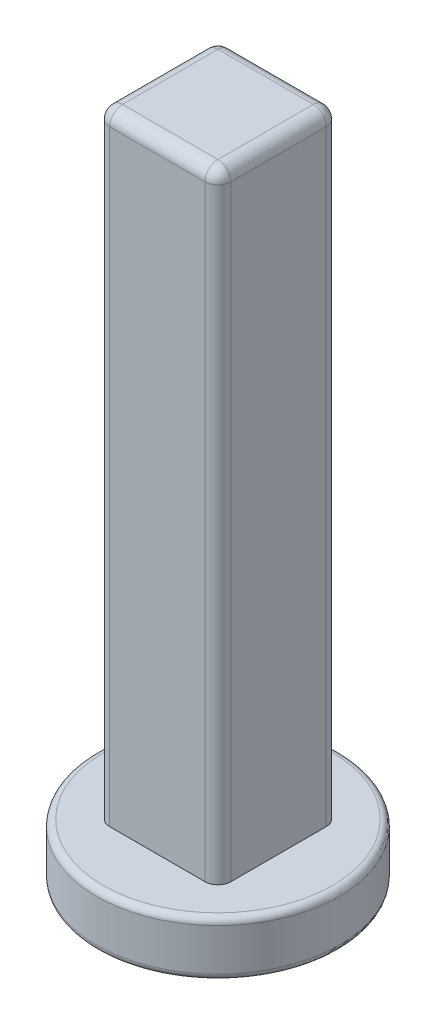
ISO-10303-21;
HEADER;
FILE_DESCRIPTION(('STEP AP214'),'2;1');
FILE_NAME('part.step','',(''),(''),'','','');
FILE_SCHEMA(('AUTOMOTIVE_DESIGN { 1 0 10303 214 1 1 1 1 }'));
ENDSEC;
DATA;
#1=APPLICATION_CONTEXT('core data for automotive mechanical design processes');
#2=APPLICATION_PROTOCOL_DEFINITION('international standard','automotive_design',2000,#1);
#3=PRODUCT_CONTEXT('',#1,'mechanical');
#4=PRODUCT('Part','Part','',(#3));
#5=PRODUCT_RELATED_PRODUCT_CATEGORY('part','',(#4));
#6=PRODUCT_DEFINITION_FORMATION('','',#4);
#7=PRODUCT_DEFINITION_CONTEXT('part definition',#1,'design');
#8=PRODUCT_DEFINITION('design','',#6,#7);
#9=PRODUCT_DEFINITION_SHAPE('','',#8);
#10=(LENGTH_UNIT() NAMED_UNIT(*) SI_UNIT(.MILLI.,.METRE.));
#11=(NAMED_UNIT(*) PLANE_ANGLE_UNIT() SI_UNIT($,.RADIAN.));
#12=(NAMED_UNIT(*) SI_UNIT($,.STERADIAN.) SOLID_ANGLE_UNIT());
#13=UNCERTAINTY_MEASURE_WITH_UNIT(LENGTH_MEASURE(1.E-05),#10,'distance_accuracy_value','');
#14=(GEOMETRIC_REPRESENTATION_CONTEXT(3) GLOBAL_UNCERTAINTY_ASSIGNED_CONTEXT((#13)) GLOBAL_UNIT_ASSIGNED_CONTEXT((#10,
#11,#12)) REPRESENTATION_CONTEXT('',''));
#15=CARTESIAN_POINT('',(0.,0.,0.));
#16=DIRECTION('',(0.,0.,1.));
#17=DIRECTION('',(1.,0.,0.));
#18=AXIS2_PLACEMENT_3D('',#15,#16,#17);
#19=CARTESIAN_POINT('',(0.,-1.7,0.));
#20=DIRECTION('',(0.,-1.,0.));
#21=DIRECTION('',(0.,0.,-1.));
#22=AXIS2_PLACEMENT_3D('',#19,#20,#21);
#23=PLANE('',#22);
#24=CARTESIAN_POINT('',(0.,-1.7,0.));
#25=DIRECTION('',(0.,1.,0.));
#26=DIRECTION('',(0.,0.,1.));
#27=AXIS2_PLACEMENT_3D('',#24,#25,#26);
#28=CIRCLE('',#27,3.55);
#29=CARTESIAN_POINT('',(0.,-1.7,3.55));
#30=VERTEX_POINT('',#29);
#31=CARTESIAN_POINT('',(3.55,-1.7,0.));
#32=VERTEX_POINT('',#31);
#33=EDGE_CURVE('E118',#30,#32,#28,.T.);
#34=ORIENTED_EDGE('',*,*,#33,.F.);
#35=CARTESIAN_POINT('',(0.,-1.7,0.));
#36=DIRECTION('',(0.,1.,0.));
#37=DIRECTION('',(1.,0.,0.));
#38=AXIS2_PLACEMENT_3D('',#35,#36,#37);
#39=CIRCLE('',#38,3.55);
#40=EDGE_CURVE('E115',#32,#30,#39,.T.);
#41=ORIENTED_EDGE('',*,*,#40,.F.);
#42=EDGE_LOOP('',(#34,#41));
#43=FACE_BOUND('',#42,.T.);
#44=ADVANCED_FACE('F17',(#43),#23,.T.);
#45=CARTESIAN_POINT('',(0.,-1.5,0.));
#46=DIRECTION('',(0.,-1.,0.));
#47=DIRECTION('',(0.,0.,-1.));
#48=AXIS2_PLACEMENT_3D('',#45,#46,#47);
#49=TOROIDAL_SURFACE('',#48,3.55,0.2);
#50=CARTESIAN_POINT('',(0.,-1.5,0.));
#51=DIRECTION('',(0.,-1.,0.));
#52=DIRECTION('',(0.,0.,-1.));
#53=AXIS2_PLACEMENT_3D('',#50,#51,#52);
#54=CIRCLE('',#53,3.75);
#55=CARTESIAN_POINT('',(0.,-1.5,-3.75));
#56=VERTEX_POINT('',#55);
#57=EDGE_CURVE('E126',#56,#56,#54,.F.);
#58=ORIENTED_EDGE('',*,*,#57,.F.);
#59=EDGE_LOOP('',(#58));
#60=FACE_BOUND('',#59,.T.);
#61=ORIENTED_EDGE('',*,*,#40,.T.);
#62=ORIENTED_EDGE('',*,*,#33,.T.);
#63=EDGE_LOOP('',(#61,#62));
#64=FACE_BOUND('',#63,.T.);
#65=ADVANCED_FACE('F125',(#60,#64),#49,.T.);
#66=CARTESIAN_POINT('',(-1.475,18.75,1.475));
#67=DIRECTION('',(-0.577350269189624,0.577350269189625,0.577350269189628));
#68=DIRECTION('',(0.,0.70710678118655,-0.707106781186545));
#69=AXIS2_PLACEMENT_3D('',#66,#67,#68);
#70=SPHERICAL_SURFACE('',#69,0.4);
#71=CARTESIAN_POINT('',(-1.70594010767585,18.9809401076758,1.70594010767585));
#72=VERTEX_POINT('',#71);
#73=VERTEX_LOOP('',#72);
#74=FACE_BOUND('',#73,.T.);
#75=CARTESIAN_POINT('',(-1.475,18.75,1.475));
#76=DIRECTION('',(0.,0.,1.));
#77=DIRECTION('',(1.,0.,0.));
#78=AXIS2_PLACEMENT_3D('',#75,#76,#77);
#79=CIRCLE('',#78,0.4);
#80=CARTESIAN_POINT('',(-1.875,18.75,1.475));
#81=VERTEX_POINT('',#80);
#82=CARTESIAN_POINT('',(-1.475,19.15,1.475));
#83=VERTEX_POINT('',#82);
#84=EDGE_CURVE('E337',#81,#83,#79,.F.);
#85=ORIENTED_EDGE('',*,*,#84,.F.);
#86=CARTESIAN_POINT('',(-1.475,18.75,1.475));
#87=DIRECTION('',(0.,1.,0.));
#88=DIRECTION('',(0.,0.,1.));
#89=AXIS2_PLACEMENT_3D('',#86,#87,#88);
#90=CIRCLE('',#89,0.400000000000001);
#91=CARTESIAN_POINT('',(-1.475,18.75,1.875));
#92=VERTEX_POINT('',#91);
#93=EDGE_CURVE('E334',#92,#81,#90,.F.);
#94=ORIENTED_EDGE('',*,*,#93,.F.);
#95=CARTESIAN_POINT('',(-1.475,18.75,1.475));
#96=DIRECTION('',(1.,0.,0.));
#97=DIRECTION('',(0.,0.,-1.));
#98=AXIS2_PLACEMENT_3D('',#95,#96,#97);
#99=CIRCLE('',#98,0.4);
#100=EDGE_CURVE('E100',#83,#92,#99,.T.);
#101=ORIENTED_EDGE('',*,*,#100,.F.);
#102=EDGE_LOOP('',(#85,#94,#101));
#103=FACE_BOUND('',#102,.T.);
#104=ADVANCED_FACE('F142',(#74,#103),#70,.T.);
#105=CARTESIAN_POINT('',(-1.475,18.75,-1.475));
#106=DIRECTION('',(-0.577350269189626,0.577350269189625,-0.577350269189626));
#107=DIRECTION('',(0.707106781186548,0.,-0.707106781186547));
#108=AXIS2_PLACEMENT_3D('',#105,#106,#107);
#109=SPHERICAL_SURFACE('',#108,0.4);
#110=CARTESIAN_POINT('',(-1.70594010767585,18.9809401076758,-1.70594010767585));
#111=VERTEX_POINT('',#110);
#112=VERTEX_LOOP('',#111);
#113=FACE_BOUND('',#112,.T.);
#114=CARTESIAN_POINT('',(-1.475,18.75,-1.475));
#115=DIRECTION('',(-1.,0.,0.));
#116=DIRECTION('',(0.,0.,1.));
#117=AXIS2_PLACEMENT_3D('',#114,#115,#116);
#118=CIRCLE('',#117,0.4);
#119=CARTESIAN_POINT('',(-1.475,18.75,-1.875));
#120=VERTEX_POINT('',#119);
#121=CARTESIAN_POINT('',(-1.475,19.15,-1.475));
#122=VERTEX_POINT('',#121);
#123=EDGE_CURVE('E329',#120,#122,#118,.F.);
#124=ORIENTED_EDGE('',*,*,#123,.F.);
#125=CARTESIAN_POINT('',(-1.475,18.75,-1.475));
#126=DIRECTION('',(0.,1.,0.));
#127=DIRECTION('',(0.,0.,1.));
#128=AXIS2_PLACEMENT_3D('',#125,#126,#127);
#129=CIRCLE('',#128,0.4);
#130=CARTESIAN_POINT('',(-1.875,18.75,-1.475));
#131=VERTEX_POINT('',#130);
#132=EDGE_CURVE('E326',#131,#120,#129,.F.);
#133=ORIENTED_EDGE('',*,*,#132,.F.);
#134=CARTESIAN_POINT('',(-1.475,18.75,-1.475));
#135=DIRECTION('',(0.,0.,1.));
#136=DIRECTION('',(1.,0.,0.));
#137=AXIS2_PLACEMENT_3D('',#134,#135,#136);
#138=CIRCLE('',#137,0.4);
#139=EDGE_CURVE('E340',#122,#131,#138,.T.);
#140=ORIENTED_EDGE('',*,*,#139,.F.);
#141=EDGE_LOOP('',(#124,#133,#140));
#142=FACE_BOUND('',#141,.T.);
#143=ADVANCED_FACE('F154',(#113,#142),#109,.T.);
#144=CARTESIAN_POINT('',(0.,-0.85,0.));
#145=DIRECTION('',(0.,-1.,0.));
#146=DIRECTION('',(0.,0.,-1.));
#147=AXIS2_PLACEMENT_3D('',#144,#145,#146);
#148=CYLINDRICAL_SURFACE('',#147,3.75);
#149=CARTESIAN_POINT('',(0.,-0.2,0.));
#150=DIRECTION('',(0.,-1.,0.));
#151=DIRECTION('',(0.,0.,-1.));
#152=AXIS2_PLACEMENT_3D('',#149,#150,#151);
#153=CIRCLE('',#152,3.75);
#154=CARTESIAN_POINT('',(0.,-0.2,-3.75));
#155=VERTEX_POINT('',#154);
#156=EDGE_CURVE('E226',#155,#155,#153,.F.);
#157=ORIENTED_EDGE('',*,*,#156,.F.);
#158=EDGE_LOOP('',(#157));
#159=FACE_BOUND('',#158,.T.);
#160=ORIENTED_EDGE('',*,*,#57,.T.);
#161=EDGE_LOOP('',(#160));
#162=FACE_BOUND('',#161,.T.);
#163=ADVANCED_FACE('F157',(#159,#162),#148,.T.);
#164=CARTESIAN_POINT('',(-0.7375,18.75,1.475));
#165=DIRECTION('',(1.,0.,0.));
#166=DIRECTION('',(0.,0.,-1.));
#167=AXIS2_PLACEMENT_3D('',#164,#165,#166);
#168=CYLINDRICAL_SURFACE('',#167,0.4);
#169=CARTESIAN_POINT('',(1.475,18.75,1.475));
#170=DIRECTION('',(1.,0.,0.));
#171=DIRECTION('',(0.,0.,-1.));
#172=AXIS2_PLACEMENT_3D('',#169,#170,#171);
#173=CIRCLE('',#172,0.4);
#174=CARTESIAN_POINT('',(1.475,19.15,1.475));
#175=VERTEX_POINT('',#174);
#176=CARTESIAN_POINT('',(1.475,18.75,1.875));
#177=VERTEX_POINT('',#176);
#178=EDGE_CURVE('E206',#175,#177,#173,.T.);
#179=ORIENTED_EDGE('',*,*,#178,.F.);
#180=DIRECTION('',(1.,0.,0.));
#181=VECTOR('',#180,1.);
#182=CARTESIAN_POINT('',(0.,19.15,1.475));
#183=LINE('',#182,#181);
#184=EDGE_CURVE('E207',#175,#83,#183,.F.);
#185=ORIENTED_EDGE('',*,*,#184,.T.);
#186=ORIENTED_EDGE('',*,*,#100,.T.);
#187=DIRECTION('',(1.,0.,0.));
#188=VECTOR('',#187,1.);
#189=CARTESIAN_POINT('',(-1.475,18.75,1.875));
#190=LINE('',#189,#188);
#191=EDGE_CURVE('E197',#177,#92,#190,.F.);
#192=ORIENTED_EDGE('',*,*,#191,.F.);
#193=EDGE_LOOP('',(#179,#185,#186,#192));
#194=FACE_BOUND('',#193,.T.);
#195=ADVANCED_FACE('F160',(#194),#168,.T.);
#196=CARTESIAN_POINT('',(-1.475,18.75,-0.7375));
#197=DIRECTION('',(0.,0.,1.));
#198=DIRECTION('',(1.,0.,0.));
#199=AXIS2_PLACEMENT_3D('',#196,#197,#198);
#200=CYLINDRICAL_SURFACE('',#199,0.4);
#201=ORIENTED_EDGE('',*,*,#84,.T.);
#202=DIRECTION('',(0.,0.,-1.));
#203=VECTOR('',#202,1.);
#204=CARTESIAN_POINT('',(-1.475,19.15,0.));
#205=LINE('',#204,#203);
#206=EDGE_CURVE('E152',#83,#122,#205,.T.);
#207=ORIENTED_EDGE('',*,*,#206,.T.);
#208=ORIENTED_EDGE('',*,*,#139,.T.);
#209=DIRECTION('',(0.,0.,1.));
#210=VECTOR('',#209,1.);
#211=CARTESIAN_POINT('',(-1.875,18.75,-1.475));
#212=LINE('',#211,#210);
#213=EDGE_CURVE('E209',#81,#131,#212,.F.);
#214=ORIENTED_EDGE('',*,*,#213,.F.);
#215=EDGE_LOOP('',(#201,#207,#208,#214));
#216=FACE_BOUND('',#215,.T.);
#217=ADVANCED_FACE('F164',(#216),#200,.T.);
#218=CARTESIAN_POINT('',(-1.475,0.,1.475));
#219=DIRECTION('',(0.,1.,0.));
#220=DIRECTION('',(0.,0.,1.));
#221=AXIS2_PLACEMENT_3D('',#218,#219,#220);
#222=CYLINDRICAL_SURFACE('',#221,0.400000000000001);
#223=CARTESIAN_POINT('',(-1.475,0.,1.475));
#224=DIRECTION('',(0.,1.,0.));
#225=DIRECTION('',(0.,0.,1.));
#226=AXIS2_PLACEMENT_3D('',#223,#224,#225);
#227=CIRCLE('',#226,0.400000000000001);
#228=CARTESIAN_POINT('',(-1.875,0.,1.475));
#229=VERTEX_POINT('',#228);
#230=CARTESIAN_POINT('',(-1.475,0.,1.875));
#231=VERTEX_POINT('',#230);
#232=EDGE_CURVE('E332',#229,#231,#227,.T.);
#233=ORIENTED_EDGE('',*,*,#232,.T.);
#234=DIRECTION('',(0.,1.,0.));
#235=VECTOR('',#234,1.);
#236=CARTESIAN_POINT('',(-1.475,0.,1.875));
#237=LINE('',#236,#235);
#238=EDGE_CURVE('E212',#92,#231,#237,.F.);
#239=ORIENTED_EDGE('',*,*,#238,.F.);
#240=ORIENTED_EDGE('',*,*,#93,.T.);
#241=DIRECTION('',(0.,1.,0.));
#242=VECTOR('',#241,1.);
#243=CARTESIAN_POINT('',(-1.875,0.,1.475));
#244=LINE('',#243,#242);
#245=EDGE_CURVE('E217',#229,#81,#244,.T.);
#246=ORIENTED_EDGE('',*,*,#245,.F.);
#247=EDGE_LOOP('',(#233,#239,#240,#246));
#248=FACE_BOUND('',#247,.T.);
#249=ADVANCED_FACE('F168',(#248),#222,.T.);
#250=CARTESIAN_POINT('',(0.7375,18.75,-1.475));
#251=DIRECTION('',(-1.,0.,0.));
#252=DIRECTION('',(0.,0.,1.));
#253=AXIS2_PLACEMENT_3D('',#250,#251,#252);
#254=CYLINDRICAL_SURFACE('',#253,0.4);
#255=ORIENTED_EDGE('',*,*,#123,.T.);
#256=DIRECTION('',(1.,0.,0.));
#257=VECTOR('',#256,1.);
#258=CARTESIAN_POINT('',(0.,19.15,-1.475));
#259=LINE('',#258,#257);
#260=CARTESIAN_POINT('',(1.475,19.15,-1.475));
#261=VERTEX_POINT('',#260);
#262=EDGE_CURVE('E204',#122,#261,#259,.T.);
#263=ORIENTED_EDGE('',*,*,#262,.T.);
#264=CARTESIAN_POINT('',(1.475,18.75,-1.475));
#265=DIRECTION('',(-1.,0.,0.));
#266=DIRECTION('',(0.,0.,1.));
#267=AXIS2_PLACEMENT_3D('',#264,#265,#266);
#268=CIRCLE('',#267,0.4);
#269=CARTESIAN_POINT('',(1.475,18.75,-1.875));
#270=VERTEX_POINT('',#269);
#271=EDGE_CURVE('E310',#270,#261,#268,.F.);
#272=ORIENTED_EDGE('',*,*,#271,.F.);
#273=DIRECTION('',(-1.,0.,0.));
#274=VECTOR('',#273,1.);
#275=CARTESIAN_POINT('',(1.475,18.75,-1.875));
#276=LINE('',#275,#274);
#277=EDGE_CURVE('E306',#120,#270,#276,.F.);
#278=ORIENTED_EDGE('',*,*,#277,.F.);
#279=EDGE_LOOP('',(#255,#263,#272,#278));
#280=FACE_BOUND('',#279,.T.);
#281=ADVANCED_FACE('F172',(#280),#254,.T.);
#282=CARTESIAN_POINT('',(-1.475,0.,-1.475));
#283=DIRECTION('',(0.,1.,0.));
#284=DIRECTION('',(0.,0.,1.));
#285=AXIS2_PLACEMENT_3D('',#282,#283,#284);
#286=CYLINDRICAL_SURFACE('',#285,0.4);
#287=CARTESIAN_POINT('',(-1.475,0.,-1.475));
#288=DIRECTION('',(0.,1.,0.));
#289=DIRECTION('',(0.,0.,1.));
#290=AXIS2_PLACEMENT_3D('',#287,#288,#289);
#291=CIRCLE('',#290,0.4);
#292=CARTESIAN_POINT('',(-1.475,0.,-1.875));
#293=VERTEX_POINT('',#292);
#294=CARTESIAN_POINT('',(-1.875,0.,-1.475));
#295=VERTEX_POINT('',#294);
#296=EDGE_CURVE('E208',#293,#295,#291,.T.);
#297=ORIENTED_EDGE('',*,*,#296,.T.);
#298=DIRECTION('',(0.,1.,0.));
#299=VECTOR('',#298,1.);
#300=CARTESIAN_POINT('',(-1.875,0.,-1.475));
#301=LINE('',#300,#299);
#302=EDGE_CURVE('E211',#131,#295,#301,.F.);
#303=ORIENTED_EDGE('',*,*,#302,.F.);
#304=ORIENTED_EDGE('',*,*,#132,.T.);
#305=DIRECTION('',(0.,1.,0.));
#306=VECTOR('',#305,1.);
#307=CARTESIAN_POINT('',(-1.475,0.,-1.875));
#308=LINE('',#307,#306);
#309=EDGE_CURVE('E309',#293,#120,#308,.T.);
#310=ORIENTED_EDGE('',*,*,#309,.F.);
#311=EDGE_LOOP('',(#297,#303,#304,#310));
#312=FACE_BOUND('',#311,.T.);
#313=ADVANCED_FACE('F176',(#312),#286,.T.);
#314=CARTESIAN_POINT('',(0.,19.15,0.));
#315=DIRECTION('',(0.,-1.,0.));
#316=DIRECTION('',(0.,0.,-1.));
#317=AXIS2_PLACEMENT_3D('',#314,#315,#316);
#318=PLANE('',#317);
#319=ORIENTED_EDGE('',*,*,#262,.F.);
#320=ORIENTED_EDGE('',*,*,#206,.F.);
#321=ORIENTED_EDGE('',*,*,#184,.F.);
#322=DIRECTION('',(0.,0.,-1.));
#323=VECTOR('',#322,1.);
#324=CARTESIAN_POINT('',(1.475,19.15,0.7375));
#325=LINE('',#324,#323);
#326=EDGE_CURVE('E199',#261,#175,#325,.F.);
#327=ORIENTED_EDGE('',*,*,#326,.F.);
#328=EDGE_LOOP('',(#319,#320,#321,#327));
#329=FACE_BOUND('',#328,.T.);
#330=ADVANCED_FACE('F180',(#329),#318,.F.);
#331=CARTESIAN_POINT('',(1.475,18.75,1.475));
#332=DIRECTION('',(0.577350269189624,0.577350269189625,0.577350269189628));
#333=DIRECTION('',(0.,0.70710678118655,-0.707106781186545));
#334=AXIS2_PLACEMENT_3D('',#331,#332,#333);
#335=SPHERICAL_SURFACE('',#334,0.4);
#336=CARTESIAN_POINT('',(1.70594010767585,18.9809401076758,1.70594010767585));
#337=VERTEX_POINT('',#336);
#338=VERTEX_LOOP('',#337);
#339=FACE_BOUND('',#338,.T.);
#340=ORIENTED_EDGE('',*,*,#178,.T.);
#341=CARTESIAN_POINT('',(1.475,18.75,1.475));
#342=DIRECTION('',(0.,1.,0.));
#343=DIRECTION('',(0.,0.,1.));
#344=AXIS2_PLACEMENT_3D('',#341,#342,#343);
#345=CIRCLE('',#344,0.4);
#346=CARTESIAN_POINT('',(1.875,18.75,1.475));
#347=VERTEX_POINT('',#346);
#348=EDGE_CURVE('E202',#347,#177,#345,.F.);
#349=ORIENTED_EDGE('',*,*,#348,.F.);
#350=CARTESIAN_POINT('',(1.475,18.75,1.475));
#351=DIRECTION('',(0.,0.,-1.));
#352=DIRECTION('',(-1.,0.,0.));
#353=AXIS2_PLACEMENT_3D('',#350,#351,#352);
#354=CIRCLE('',#353,0.4);
#355=EDGE_CURVE('E312',#175,#347,#354,.T.);
#356=ORIENTED_EDGE('',*,*,#355,.F.);
#357=EDGE_LOOP('',(#340,#349,#356));
#358=FACE_BOUND('',#357,.T.);
#359=ADVANCED_FACE('F184',(#339,#358),#335,.T.);
#360=CARTESIAN_POINT('',(0.,-0.2,0.));
#361=DIRECTION('',(0.,-1.,0.));
#362=DIRECTION('',(0.,0.,-1.));
#363=AXIS2_PLACEMENT_3D('',#360,#361,#362);
#364=TOROIDAL_SURFACE('',#363,3.55,0.2);
#365=CARTESIAN_POINT('',(0.,0.,0.));
#366=DIRECTION('',(0.,-1.,0.));
#367=DIRECTION('',(1.,0.,0.));
#368=AXIS2_PLACEMENT_3D('',#365,#366,#367);
#369=CIRCLE('',#368,3.55);
#370=CARTESIAN_POINT('',(0.,0.,3.55));
#371=VERTEX_POINT('',#370);
#372=CARTESIAN_POINT('',(3.55,0.,0.));
#373=VERTEX_POINT('',#372);
#374=EDGE_CURVE('E230',#371,#373,#369,.F.);
#375=ORIENTED_EDGE('',*,*,#374,.F.);
#376=CARTESIAN_POINT('',(0.,0.,0.));
#377=DIRECTION('',(0.,-1.,0.));
#378=DIRECTION('',(0.,0.,1.));
#379=AXIS2_PLACEMENT_3D('',#376,#377,#378);
#380=CIRCLE('',#379,3.55);
#381=EDGE_CURVE('E238',#373,#371,#380,.F.);
#382=ORIENTED_EDGE('',*,*,#381,.F.);
#383=EDGE_LOOP('',(#375,#382));
#384=FACE_BOUND('',#383,.T.);
#385=ORIENTED_EDGE('',*,*,#156,.T.);
#386=EDGE_LOOP('',(#385));
#387=FACE_BOUND('',#386,.T.);
#388=ADVANCED_FACE('F189',(#384,#387),#364,.T.);
#389=CARTESIAN_POINT('',(-1.475,0.,1.875));
#390=DIRECTION('',(0.,0.,1.));
#391=DIRECTION('',(1.,0.,0.));
#392=AXIS2_PLACEMENT_3D('',#389,#390,#391);
#393=PLANE('',#392);
#394=DIRECTION('',(1.,0.,0.));
#395=VECTOR('',#394,1.);
#396=CARTESIAN_POINT('',(3.55,0.,1.875));
#397=LINE('',#396,#395);
#398=CARTESIAN_POINT('',(1.475,0.,1.875));
#399=VERTEX_POINT('',#398);
#400=EDGE_CURVE('E385',#399,#231,#397,.F.);
#401=ORIENTED_EDGE('',*,*,#400,.F.);
#402=DIRECTION('',(0.,1.,0.));
#403=VECTOR('',#402,1.);
#404=CARTESIAN_POINT('',(1.475,0.,1.875));
#405=LINE('',#404,#403);
#406=EDGE_CURVE('E229',#177,#399,#405,.F.);
#407=ORIENTED_EDGE('',*,*,#406,.F.);
#408=ORIENTED_EDGE('',*,*,#191,.T.);
#409=ORIENTED_EDGE('',*,*,#238,.T.);
#410=EDGE_LOOP('',(#401,#407,#408,#409));
#411=FACE_BOUND('',#410,.T.);
#412=ADVANCED_FACE('F352',(#411),#393,.T.);
#413=CARTESIAN_POINT('',(-1.875,0.,-1.475));
#414=DIRECTION('',(-1.,0.,0.));
#415=DIRECTION('',(0.,0.,1.));
#416=AXIS2_PLACEMENT_3D('',#413,#414,#415);
#417=PLANE('',#416);
#418=DIRECTION('',(0.,0.,1.));
#419=VECTOR('',#418,1.);
#420=CARTESIAN_POINT('',(-1.875,0.,0.));
#421=LINE('',#420,#419);
#422=EDGE_CURVE('E394',#229,#295,#421,.F.);
#423=ORIENTED_EDGE('',*,*,#422,.F.);
#424=ORIENTED_EDGE('',*,*,#245,.T.);
#425=ORIENTED_EDGE('',*,*,#213,.T.);
#426=ORIENTED_EDGE('',*,*,#302,.T.);
#427=EDGE_LOOP('',(#423,#424,#425,#426));
#428=FACE_BOUND('',#427,.T.);
#429=ADVANCED_FACE('F299',(#428),#417,.T.);
#430=CARTESIAN_POINT('',(1.475,18.75,-1.475));
#431=DIRECTION('',(0.577350269189624,0.577350269189625,-0.577350269189628));
#432=DIRECTION('',(0.,-0.70710678118655,-0.707106781186545));
#433=AXIS2_PLACEMENT_3D('',#430,#431,#432);
#434=SPHERICAL_SURFACE('',#433,0.4);
#435=CARTESIAN_POINT('',(1.70594010767585,18.9809401076758,-1.70594010767585));
#436=VERTEX_POINT('',#435);
#437=VERTEX_LOOP('',#436);
#438=FACE_BOUND('',#437,.T.);
#439=CARTESIAN_POINT('',(1.475,18.75,-1.475));
#440=DIRECTION('',(0.,0.,-1.));
#441=DIRECTION('',(-1.,0.,0.));
#442=AXIS2_PLACEMENT_3D('',#439,#440,#441);
#443=CIRCLE('',#442,0.4);
#444=CARTESIAN_POINT('',(1.875,18.75,-1.475));
#445=VERTEX_POINT('',#444);
#446=EDGE_CURVE('E203',#445,#261,#443,.F.);
#447=ORIENTED_EDGE('',*,*,#446,.F.);
#448=CARTESIAN_POINT('',(1.475,18.75,-1.475));
#449=DIRECTION('',(0.,1.,0.));
#450=DIRECTION('',(0.,0.,1.));
#451=AXIS2_PLACEMENT_3D('',#448,#449,#450);
#452=CIRCLE('',#451,0.4);
#453=EDGE_CURVE('E378',#270,#445,#452,.F.);
#454=ORIENTED_EDGE('',*,*,#453,.F.);
#455=ORIENTED_EDGE('',*,*,#271,.T.);
#456=EDGE_LOOP('',(#447,#454,#455));
#457=FACE_BOUND('',#456,.T.);
#458=ADVANCED_FACE('F294',(#438,#457),#434,.T.);
#459=CARTESIAN_POINT('',(1.475,0.,-1.875));
#460=DIRECTION('',(0.,0.,-1.));
#461=DIRECTION('',(-1.,0.,0.));
#462=AXIS2_PLACEMENT_3D('',#459,#460,#461);
#463=PLANE('',#462);
#464=DIRECTION('',(1.,0.,0.));
#465=VECTOR('',#464,1.);
#466=CARTESIAN_POINT('',(3.55,0.,-1.875));
#467=LINE('',#466,#465);
#468=CARTESIAN_POINT('',(1.475,0.,-1.875));
#469=VERTEX_POINT('',#468);
#470=EDGE_CURVE('E269',#293,#469,#467,.T.);
#471=ORIENTED_EDGE('',*,*,#470,.F.);
#472=ORIENTED_EDGE('',*,*,#309,.T.);
#473=ORIENTED_EDGE('',*,*,#277,.T.);
#474=DIRECTION('',(0.,1.,0.));
#475=VECTOR('',#474,1.);
#476=CARTESIAN_POINT('',(1.475,0.,-1.875));
#477=LINE('',#476,#475);
#478=EDGE_CURVE('E304',#469,#270,#477,.T.);
#479=ORIENTED_EDGE('',*,*,#478,.F.);
#480=EDGE_LOOP('',(#471,#472,#473,#479));
#481=FACE_BOUND('',#480,.T.);
#482=ADVANCED_FACE('F290',(#481),#463,.T.);
#483=CARTESIAN_POINT('',(1.475,18.75,0.7375));
#484=DIRECTION('',(0.,0.,-1.));
#485=DIRECTION('',(-1.,0.,0.));
#486=AXIS2_PLACEMENT_3D('',#483,#484,#485);
#487=CYLINDRICAL_SURFACE('',#486,0.4);
#488=ORIENTED_EDGE('',*,*,#446,.T.);
#489=ORIENTED_EDGE('',*,*,#326,.T.);
#490=ORIENTED_EDGE('',*,*,#355,.T.);
#491=DIRECTION('',(0.,0.,-1.));
#492=VECTOR('',#491,1.);
#493=CARTESIAN_POINT('',(1.875,18.75,1.475));
#494=LINE('',#493,#492);
#495=EDGE_CURVE('E371',#445,#347,#494,.F.);
#496=ORIENTED_EDGE('',*,*,#495,.F.);
#497=EDGE_LOOP('',(#488,#489,#490,#496));
#498=FACE_BOUND('',#497,.T.);
#499=ADVANCED_FACE('F286',(#498),#487,.T.);
#500=CARTESIAN_POINT('',(1.475,0.,1.475));
#501=DIRECTION('',(0.,1.,0.));
#502=DIRECTION('',(0.,0.,1.));
#503=AXIS2_PLACEMENT_3D('',#500,#501,#502);
#504=CYLINDRICAL_SURFACE('',#503,0.4);
#505=CARTESIAN_POINT('',(1.475,0.,1.475));
#506=DIRECTION('',(0.,1.,0.));
#507=DIRECTION('',(0.,0.,1.));
#508=AXIS2_PLACEMENT_3D('',#505,#506,#507);
#509=CIRCLE('',#508,0.4);
#510=CARTESIAN_POINT('',(1.875,0.,1.475));
#511=VERTEX_POINT('',#510);
#512=EDGE_CURVE('E260',#511,#399,#509,.F.);
#513=ORIENTED_EDGE('',*,*,#512,.F.);
#514=DIRECTION('',(0.,1.,0.));
#515=VECTOR('',#514,1.);
#516=CARTESIAN_POINT('',(1.875,0.,1.475));
#517=LINE('',#516,#515);
#518=EDGE_CURVE('E368',#347,#511,#517,.F.);
#519=ORIENTED_EDGE('',*,*,#518,.F.);
#520=ORIENTED_EDGE('',*,*,#348,.T.);
#521=ORIENTED_EDGE('',*,*,#406,.T.);
#522=EDGE_LOOP('',(#513,#519,#520,#521));
#523=FACE_BOUND('',#522,.T.);
#524=ADVANCED_FACE('F281',(#523),#504,.T.);
#525=CARTESIAN_POINT('',(3.55,0.,0.));
#526=DIRECTION('',(0.,1.,0.));
#527=DIRECTION('',(0.,0.,1.));
#528=AXIS2_PLACEMENT_3D('',#525,#526,#527);
#529=PLANE('',#528);
#530=ORIENTED_EDGE('',*,*,#296,.F.);
#531=ORIENTED_EDGE('',*,*,#470,.T.);
#532=CARTESIAN_POINT('',(1.475,0.,-1.475));
#533=DIRECTION('',(0.,1.,0.));
#534=DIRECTION('',(0.,0.,1.));
#535=AXIS2_PLACEMENT_3D('',#532,#533,#534);
#536=CIRCLE('',#535,0.4);
#537=CARTESIAN_POINT('',(1.875,0.,-1.475));
#538=VERTEX_POINT('',#537);
#539=EDGE_CURVE('E36',#538,#469,#536,.T.);
#540=ORIENTED_EDGE('',*,*,#539,.F.);
#541=DIRECTION('',(0.,0.,-1.));
#542=VECTOR('',#541,1.);
#543=CARTESIAN_POINT('',(1.875,0.,1.475));
#544=LINE('',#543,#542);
#545=EDGE_CURVE('E27',#511,#538,#544,.T.);
#546=ORIENTED_EDGE('',*,*,#545,.F.);
#547=ORIENTED_EDGE('',*,*,#512,.T.);
#548=ORIENTED_EDGE('',*,*,#400,.T.);
#549=ORIENTED_EDGE('',*,*,#232,.F.);
#550=ORIENTED_EDGE('',*,*,#422,.T.);
#551=EDGE_LOOP('',(#530,#531,#540,#546,#547,#548,#549,#550));
#552=FACE_BOUND('',#551,.T.);
#553=ORIENTED_EDGE('',*,*,#374,.T.);
#554=ORIENTED_EDGE('',*,*,#381,.T.);
#555=EDGE_LOOP('',(#553,#554));
#556=FACE_BOUND('',#555,.T.);
#557=ADVANCED_FACE('F259',(#552,#556),#529,.T.);
#558=CARTESIAN_POINT('',(1.475,0.,-1.475));
#559=DIRECTION('',(0.,1.,0.));
#560=DIRECTION('',(0.,0.,1.));
#561=AXIS2_PLACEMENT_3D('',#558,#559,#560);
#562=CYLINDRICAL_SURFACE('',#561,0.4);
#563=ORIENTED_EDGE('',*,*,#539,.T.);
#564=ORIENTED_EDGE('',*,*,#478,.T.);
#565=ORIENTED_EDGE('',*,*,#453,.T.);
#566=DIRECTION('',(0.,1.,0.));
#567=VECTOR('',#566,1.);
#568=CARTESIAN_POINT('',(1.875,0.,-1.475));
#569=LINE('',#568,#567);
#570=EDGE_CURVE('E11',#538,#445,#569,.T.);
#571=ORIENTED_EDGE('',*,*,#570,.F.);
#572=EDGE_LOOP('',(#563,#564,#565,#571));
#573=FACE_BOUND('',#572,.T.);
#574=ADVANCED_FACE('F280',(#573),#562,.T.);
#575=CARTESIAN_POINT('',(1.875,0.,1.475));
#576=DIRECTION('',(1.,0.,0.));
#577=DIRECTION('',(0.,0.,-1.));
#578=AXIS2_PLACEMENT_3D('',#575,#576,#577);
#579=PLANE('',#578);
#580=ORIENTED_EDGE('',*,*,#545,.T.);
#581=ORIENTED_EDGE('',*,*,#570,.T.);
#582=ORIENTED_EDGE('',*,*,#495,.T.);
#583=ORIENTED_EDGE('',*,*,#518,.T.);
#584=EDGE_LOOP('',(#580,#581,#582,#583));
#585=FACE_BOUND('',#584,.T.);
#586=ADVANCED_FACE('F357',(#585),#579,.T.);
#587=CLOSED_SHELL('',(#44,#65,#104,#143,#163,#195,#217,#249,#281,#313,#330,#359,#388,#412,#429,
#458,#482,#499,#524,#557,#574,#586));
#588=MANIFOLD_SOLID_BREP('B1',#587);
#589=ADVANCED_BREP_SHAPE_REPRESENTATION('',(#18,#588),#14);
#590=SHAPE_DEFINITION_REPRESENTATION(#9,#589);
ENDSEC;
END-ISO-10303-21;
